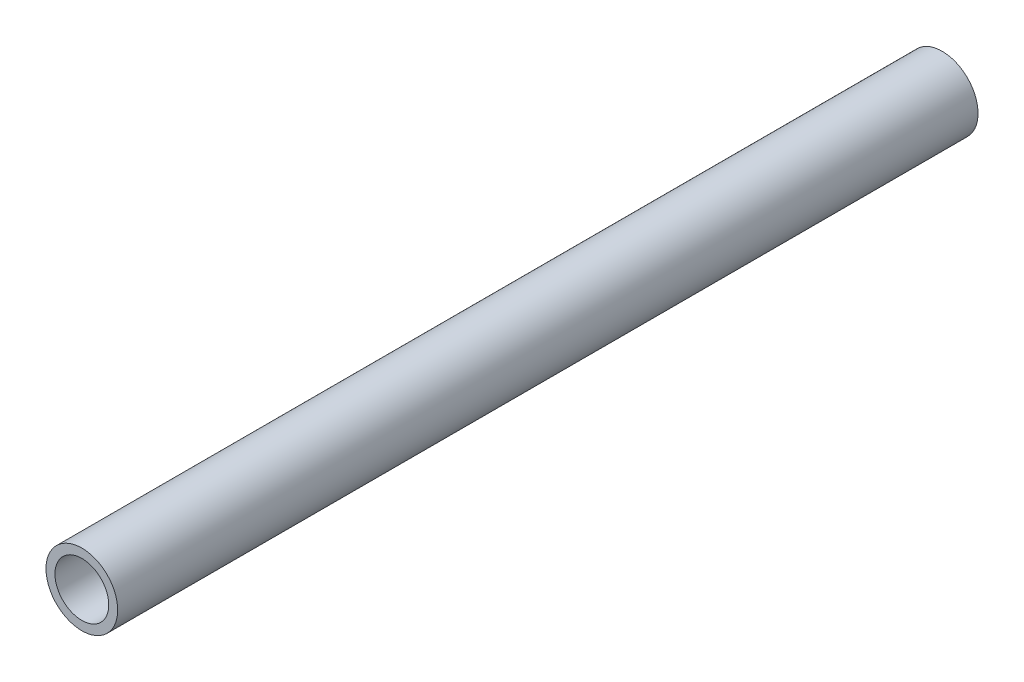
ISO-10303-21;
HEADER;
FILE_DESCRIPTION(('STEP AP214'),'2;1');
FILE_NAME('part.step','',(''),(''),'','','');
FILE_SCHEMA(('AUTOMOTIVE_DESIGN { 1 0 10303 214 1 1 1 1 }'));
ENDSEC;
DATA;
#1=APPLICATION_CONTEXT('core data for automotive mechanical design processes');
#2=APPLICATION_PROTOCOL_DEFINITION('international standard','automotive_design',2000,#1);
#3=PRODUCT_CONTEXT('',#1,'mechanical');
#4=PRODUCT('Part','Part','',(#3));
#5=PRODUCT_RELATED_PRODUCT_CATEGORY('part','',(#4));
#6=PRODUCT_DEFINITION_FORMATION('','',#4);
#7=PRODUCT_DEFINITION_CONTEXT('part definition',#1,'design');
#8=PRODUCT_DEFINITION('design','',#6,#7);
#9=PRODUCT_DEFINITION_SHAPE('','',#8);
#10=(LENGTH_UNIT() NAMED_UNIT(*) SI_UNIT(.MILLI.,.METRE.));
#11=(NAMED_UNIT(*) PLANE_ANGLE_UNIT() SI_UNIT($,.RADIAN.));
#12=(NAMED_UNIT(*) SI_UNIT($,.STERADIAN.) SOLID_ANGLE_UNIT());
#13=UNCERTAINTY_MEASURE_WITH_UNIT(LENGTH_MEASURE(1.E-05),#10,'distance_accuracy_value','');
#14=(GEOMETRIC_REPRESENTATION_CONTEXT(3) GLOBAL_UNCERTAINTY_ASSIGNED_CONTEXT((#13)) GLOBAL_UNIT_ASSIGNED_CONTEXT((#10,
#11,#12)) REPRESENTATION_CONTEXT('',''));
#15=CARTESIAN_POINT('',(0.,0.,0.));
#16=DIRECTION('',(0.,0.,1.));
#17=DIRECTION('',(1.,0.,0.));
#18=AXIS2_PLACEMENT_3D('',#15,#16,#17);
#19=CARTESIAN_POINT('',(0.,0.,152.4));
#20=DIRECTION('',(0.,0.,1.));
#21=DIRECTION('',(1.,0.,0.));
#22=AXIS2_PLACEMENT_3D('',#19,#20,#21);
#23=PLANE('',#22);
#24=CARTESIAN_POINT('',(0.,0.,152.4));
#25=DIRECTION('',(0.,0.,1.));
#26=DIRECTION('',(1.,0.,0.));
#27=AXIS2_PLACEMENT_3D('',#24,#25,#26);
#28=CIRCLE('',#27,6.35);
#29=CARTESIAN_POINT('',(-6.35,0.,152.4));
#30=VERTEX_POINT('',#29);
#31=EDGE_CURVE('E10',#30,#30,#28,.T.);
#32=ORIENTED_EDGE('',*,*,#31,.T.);
#33=EDGE_LOOP('',(#32));
#34=FACE_BOUND('',#33,.T.);
#35=CARTESIAN_POINT('',(0.,0.,152.4));
#36=DIRECTION('',(0.,0.,1.));
#37=DIRECTION('',(1.,0.,0.));
#38=AXIS2_PLACEMENT_3D('',#35,#36,#37);
#39=CIRCLE('',#38,4.7625);
#40=CARTESIAN_POINT('',(-4.7625,0.,152.4));
#41=VERTEX_POINT('',#40);
#42=EDGE_CURVE('E41',#41,#41,#39,.T.);
#43=ORIENTED_EDGE('',*,*,#42,.F.);
#44=EDGE_LOOP('',(#43));
#45=FACE_BOUND('',#44,.T.);
#46=ADVANCED_FACE('F30',(#34,#45),#23,.T.);
#47=CARTESIAN_POINT('',(0.,0.,0.));
#48=DIRECTION('',(0.,0.,1.));
#49=DIRECTION('',(1.,0.,0.));
#50=AXIS2_PLACEMENT_3D('',#47,#48,#49);
#51=PLANE('',#50);
#52=CARTESIAN_POINT('',(0.,0.,0.));
#53=DIRECTION('',(0.,0.,1.));
#54=DIRECTION('',(1.,0.,0.));
#55=AXIS2_PLACEMENT_3D('',#52,#53,#54);
#56=CIRCLE('',#55,6.35);
#57=CARTESIAN_POINT('',(-6.35,0.,0.));
#58=VERTEX_POINT('',#57);
#59=EDGE_CURVE('E34',#58,#58,#56,.T.);
#60=ORIENTED_EDGE('',*,*,#59,.F.);
#61=EDGE_LOOP('',(#60));
#62=FACE_BOUND('',#61,.T.);
#63=CARTESIAN_POINT('',(0.,0.,0.));
#64=DIRECTION('',(0.,0.,1.));
#65=DIRECTION('',(1.,0.,0.));
#66=AXIS2_PLACEMENT_3D('',#63,#64,#65);
#67=CIRCLE('',#66,4.7625);
#68=CARTESIAN_POINT('',(-4.7625,0.,0.));
#69=VERTEX_POINT('',#68);
#70=EDGE_CURVE('E43',#69,#69,#67,.T.);
#71=ORIENTED_EDGE('',*,*,#70,.T.);
#72=EDGE_LOOP('',(#71));
#73=FACE_BOUND('',#72,.T.);
#74=ADVANCED_FACE('F53',(#62,#73),#51,.F.);
#75=CARTESIAN_POINT('',(0.,0.,152.4));
#76=DIRECTION('',(0.,0.,-1.));
#77=DIRECTION('',(-1.,0.,0.));
#78=AXIS2_PLACEMENT_3D('',#75,#76,#77);
#79=CYLINDRICAL_SURFACE('',#78,6.35);
#80=CARTESIAN_POINT('',(-6.35,0.,152.4));
#81=CARTESIAN_POINT('',(-6.35,0.,150.8125));
#82=CARTESIAN_POINT('',(-6.35,0.,149.225));
#83=CARTESIAN_POINT('',(-6.35,0.,146.05));
#84=CARTESIAN_POINT('',(-6.35,0.,144.4625));
#85=CARTESIAN_POINT('',(-6.35,0.,141.2875));
#86=CARTESIAN_POINT('',(-6.35,0.,139.7));
#87=CARTESIAN_POINT('',(-6.35,0.,136.525));
#88=CARTESIAN_POINT('',(-6.35,0.,134.9375));
#89=CARTESIAN_POINT('',(-6.35,0.,131.7625));
#90=CARTESIAN_POINT('',(-6.35,0.,130.175));
#91=CARTESIAN_POINT('',(-6.35,0.,127.));
#92=CARTESIAN_POINT('',(-6.35,0.,125.4125));
#93=CARTESIAN_POINT('',(-6.35,0.,122.2375));
#94=CARTESIAN_POINT('',(-6.35,0.,120.65));
#95=CARTESIAN_POINT('',(-6.35,0.,117.475));
#96=CARTESIAN_POINT('',(-6.35,0.,115.8875));
#97=CARTESIAN_POINT('',(-6.35,0.,112.7125));
#98=CARTESIAN_POINT('',(-6.35,0.,111.125));
#99=CARTESIAN_POINT('',(-6.35,0.,107.95));
#100=CARTESIAN_POINT('',(-6.35,0.,106.3625));
#101=CARTESIAN_POINT('',(-6.35,0.,103.1875));
#102=CARTESIAN_POINT('',(-6.35,0.,101.6));
#103=CARTESIAN_POINT('',(-6.35,0.,98.425));
#104=CARTESIAN_POINT('',(-6.35,0.,96.8375));
#105=CARTESIAN_POINT('',(-6.35,0.,93.6625));
#106=CARTESIAN_POINT('',(-6.35,0.,92.075));
#107=CARTESIAN_POINT('',(-6.35,0.,88.9));
#108=CARTESIAN_POINT('',(-6.35,0.,87.3125));
#109=CARTESIAN_POINT('',(-6.35,0.,84.1375));
#110=CARTESIAN_POINT('',(-6.35,0.,82.55));
#111=CARTESIAN_POINT('',(-6.35,0.,79.375));
#112=CARTESIAN_POINT('',(-6.35,0.,77.7875));
#113=CARTESIAN_POINT('',(-6.35,0.,74.6125));
#114=CARTESIAN_POINT('',(-6.35,0.,73.025));
#115=CARTESIAN_POINT('',(-6.35,0.,69.85));
#116=CARTESIAN_POINT('',(-6.35,0.,68.2625));
#117=CARTESIAN_POINT('',(-6.35,0.,65.0875));
#118=CARTESIAN_POINT('',(-6.35,0.,63.5));
#119=CARTESIAN_POINT('',(-6.35,0.,60.325));
#120=CARTESIAN_POINT('',(-6.35,0.,58.7375));
#121=CARTESIAN_POINT('',(-6.35,0.,55.5625));
#122=CARTESIAN_POINT('',(-6.35,0.,53.975));
#123=CARTESIAN_POINT('',(-6.35,0.,50.8));
#124=CARTESIAN_POINT('',(-6.35,0.,49.2125));
#125=CARTESIAN_POINT('',(-6.35,0.,46.0375));
#126=CARTESIAN_POINT('',(-6.35,0.,44.45));
#127=CARTESIAN_POINT('',(-6.35,0.,41.275));
#128=CARTESIAN_POINT('',(-6.35,0.,39.6875));
#129=CARTESIAN_POINT('',(-6.35,0.,36.5125));
#130=CARTESIAN_POINT('',(-6.35,0.,34.925));
#131=CARTESIAN_POINT('',(-6.35,0.,31.75));
#132=CARTESIAN_POINT('',(-6.35,0.,30.1625));
#133=CARTESIAN_POINT('',(-6.35,0.,26.9875));
#134=CARTESIAN_POINT('',(-6.35,0.,25.4));
#135=CARTESIAN_POINT('',(-6.35,0.,22.225));
#136=CARTESIAN_POINT('',(-6.35,0.,20.6375));
#137=CARTESIAN_POINT('',(-6.35,0.,17.4625));
#138=CARTESIAN_POINT('',(-6.35,0.,15.875));
#139=CARTESIAN_POINT('',(-6.35,0.,12.7));
#140=CARTESIAN_POINT('',(-6.35,0.,11.1125));
#141=CARTESIAN_POINT('',(-6.35,0.,7.93750000000001));
#142=CARTESIAN_POINT('',(-6.35,0.,6.35));
#143=CARTESIAN_POINT('',(-6.35,0.,3.175));
#144=CARTESIAN_POINT('',(-6.35,0.,1.5875));
#145=CARTESIAN_POINT('',(-6.35,0.,0.));
#146=B_SPLINE_CURVE_WITH_KNOTS('',3,(#80,#81,#82,#83,#84,#85,#86,#87,#88,#89,#90,#91,#92,#93,
#94,#95,#96,#97,#98,#99,#100,#101,#102,#103,#104,#105,#106,#107,#108,#109,#110,#111,#112,#113,
#114,#115,#116,#117,#118,#119,#120,#121,#122,#123,#124,#125,#126,#127,#128,#129,#130,#131,#132,
#133,#134,#135,#136,#137,#138,#139,#140,#141,#142,#143,#144,#145),.UNSPECIFIED.,.F.,.F.,(4,2,2,
2,2,2,2,2,2,2,2,2,2,2,2,2,2,2,2,2,2,2,2,2,2,2,2,2,2,2,2,2,4),(0.,4.7625,9.52500000000001,
14.2875,19.05,23.8125,28.575,33.3375,38.1,42.8625,47.625,52.3875,57.15,61.9125,66.675,71.4375,
76.2,80.9625,85.725,90.4875,95.25,100.0125,104.775,109.5375,114.3,119.0625,123.825,128.5875,
133.35,138.1125,142.875,147.6375,152.4),.UNSPECIFIED.);
#147=EDGE_CURVE('BSEAM32',#30,#58,#146,.T.);
#148=ORIENTED_EDGE('',*,*,#31,.F.);
#149=ORIENTED_EDGE('',*,*,#59,.T.);
#150=ORIENTED_EDGE('',*,*,#147,.T.);
#151=ORIENTED_EDGE('',*,*,#147,.F.);
#152=EDGE_LOOP('',(#148,#150,#149,#151));
#153=FACE_BOUND('',#152,.T.);
#154=ADVANCED_FACE('F32',(#153),#79,.T.);
#155=CARTESIAN_POINT('',(0.,0.,152.4));
#156=DIRECTION('',(0.,0.,-1.));
#157=DIRECTION('',(-1.,0.,0.));
#158=AXIS2_PLACEMENT_3D('',#155,#156,#157);
#159=CYLINDRICAL_SURFACE('',#158,4.7625);
#160=CARTESIAN_POINT('',(-4.7625,0.,152.4));
#161=CARTESIAN_POINT('',(-4.7625,0.,150.8125));
#162=CARTESIAN_POINT('',(-4.7625,0.,149.225));
#163=CARTESIAN_POINT('',(-4.7625,0.,146.05));
#164=CARTESIAN_POINT('',(-4.7625,0.,144.4625));
#165=CARTESIAN_POINT('',(-4.7625,0.,141.2875));
#166=CARTESIAN_POINT('',(-4.7625,0.,139.7));
#167=CARTESIAN_POINT('',(-4.7625,0.,136.525));
#168=CARTESIAN_POINT('',(-4.7625,0.,134.9375));
#169=CARTESIAN_POINT('',(-4.7625,0.,131.7625));
#170=CARTESIAN_POINT('',(-4.7625,0.,130.175));
#171=CARTESIAN_POINT('',(-4.7625,0.,127.));
#172=CARTESIAN_POINT('',(-4.7625,0.,125.4125));
#173=CARTESIAN_POINT('',(-4.7625,0.,122.2375));
#174=CARTESIAN_POINT('',(-4.7625,0.,120.65));
#175=CARTESIAN_POINT('',(-4.7625,0.,117.475));
#176=CARTESIAN_POINT('',(-4.7625,0.,115.8875));
#177=CARTESIAN_POINT('',(-4.7625,0.,112.7125));
#178=CARTESIAN_POINT('',(-4.7625,0.,111.125));
#179=CARTESIAN_POINT('',(-4.7625,0.,107.95));
#180=CARTESIAN_POINT('',(-4.7625,0.,106.3625));
#181=CARTESIAN_POINT('',(-4.7625,0.,103.1875));
#182=CARTESIAN_POINT('',(-4.7625,0.,101.6));
#183=CARTESIAN_POINT('',(-4.7625,0.,98.425));
#184=CARTESIAN_POINT('',(-4.7625,0.,96.8375));
#185=CARTESIAN_POINT('',(-4.7625,0.,93.6625));
#186=CARTESIAN_POINT('',(-4.7625,0.,92.075));
#187=CARTESIAN_POINT('',(-4.7625,0.,88.9));
#188=CARTESIAN_POINT('',(-4.7625,0.,87.3125));
#189=CARTESIAN_POINT('',(-4.7625,0.,84.1375));
#190=CARTESIAN_POINT('',(-4.7625,0.,82.55));
#191=CARTESIAN_POINT('',(-4.7625,0.,79.375));
#192=CARTESIAN_POINT('',(-4.7625,0.,77.7875));
#193=CARTESIAN_POINT('',(-4.7625,0.,74.6125));
#194=CARTESIAN_POINT('',(-4.7625,0.,73.025));
#195=CARTESIAN_POINT('',(-4.7625,0.,69.85));
#196=CARTESIAN_POINT('',(-4.7625,0.,68.2625));
#197=CARTESIAN_POINT('',(-4.7625,0.,65.0875));
#198=CARTESIAN_POINT('',(-4.7625,0.,63.5));
#199=CARTESIAN_POINT('',(-4.7625,0.,60.325));
#200=CARTESIAN_POINT('',(-4.7625,0.,58.7375));
#201=CARTESIAN_POINT('',(-4.7625,0.,55.5625));
#202=CARTESIAN_POINT('',(-4.7625,0.,53.975));
#203=CARTESIAN_POINT('',(-4.7625,0.,50.8));
#204=CARTESIAN_POINT('',(-4.7625,0.,49.2125));
#205=CARTESIAN_POINT('',(-4.7625,0.,46.0375));
#206=CARTESIAN_POINT('',(-4.7625,0.,44.45));
#207=CARTESIAN_POINT('',(-4.7625,0.,41.275));
#208=CARTESIAN_POINT('',(-4.7625,0.,39.6875));
#209=CARTESIAN_POINT('',(-4.7625,0.,36.5125));
#210=CARTESIAN_POINT('',(-4.7625,0.,34.925));
#211=CARTESIAN_POINT('',(-4.7625,0.,31.75));
#212=CARTESIAN_POINT('',(-4.7625,0.,30.1625));
#213=CARTESIAN_POINT('',(-4.7625,0.,26.9875));
#214=CARTESIAN_POINT('',(-4.7625,0.,25.4));
#215=CARTESIAN_POINT('',(-4.7625,0.,22.225));
#216=CARTESIAN_POINT('',(-4.7625,0.,20.6375));
#217=CARTESIAN_POINT('',(-4.7625,0.,17.4625));
#218=CARTESIAN_POINT('',(-4.7625,0.,15.875));
#219=CARTESIAN_POINT('',(-4.7625,0.,12.7));
#220=CARTESIAN_POINT('',(-4.7625,0.,11.1125));
#221=CARTESIAN_POINT('',(-4.7625,0.,7.93750000000001));
#222=CARTESIAN_POINT('',(-4.7625,0.,6.35));
#223=CARTESIAN_POINT('',(-4.7625,0.,3.175));
#224=CARTESIAN_POINT('',(-4.7625,0.,1.5875));
#225=CARTESIAN_POINT('',(-4.7625,0.,0.));
#226=B_SPLINE_CURVE_WITH_KNOTS('',3,(#160,#161,#162,#163,#164,#165,#166,#167,#168,#169,#170,
#171,#172,#173,#174,#175,#176,#177,#178,#179,#180,#181,#182,#183,#184,#185,#186,#187,#188,#189,
#190,#191,#192,#193,#194,#195,#196,#197,#198,#199,#200,#201,#202,#203,#204,#205,#206,#207,#208,
#209,#210,#211,#212,#213,#214,#215,#216,#217,#218,#219,#220,#221,#222,#223,#224,#225),
.UNSPECIFIED.,.F.,.F.,(4,2,2,2,2,2,2,2,2,2,2,2,2,2,2,2,2,2,2,2,2,2,2,2,2,2,2,2,2,2,2,2,4),(0.,
4.76249999999998,9.52499999999998,14.2875,19.05,23.8125,28.575,33.3375,38.1,42.8625,47.625,
52.3875,57.15,61.9125,66.675,71.4375,76.2,80.9625,85.725,90.4875,95.25,100.0125,104.775,
109.5375,114.3,119.0625,123.825,128.5875,133.35,138.1125,142.875,147.6375,152.4),.UNSPECIFIED.);
#227=EDGE_CURVE('BSEAM49',#41,#69,#226,.T.);
#228=ORIENTED_EDGE('',*,*,#42,.T.);
#229=ORIENTED_EDGE('',*,*,#70,.F.);
#230=ORIENTED_EDGE('',*,*,#227,.T.);
#231=ORIENTED_EDGE('',*,*,#227,.F.);
#232=EDGE_LOOP('',(#228,#230,#229,#231));
#233=FACE_BOUND('',#232,.T.);
#234=ADVANCED_FACE('F49',(#233),#159,.F.);
#235=CLOSED_SHELL('',(#46,#74,#154,#234));
#236=MANIFOLD_SOLID_BREP('B2',#235);
#237=ADVANCED_BREP_SHAPE_REPRESENTATION('',(#18,#236),#14);
#238=SHAPE_DEFINITION_REPRESENTATION(#9,#237);
ENDSEC;
END-ISO-10303-21;
